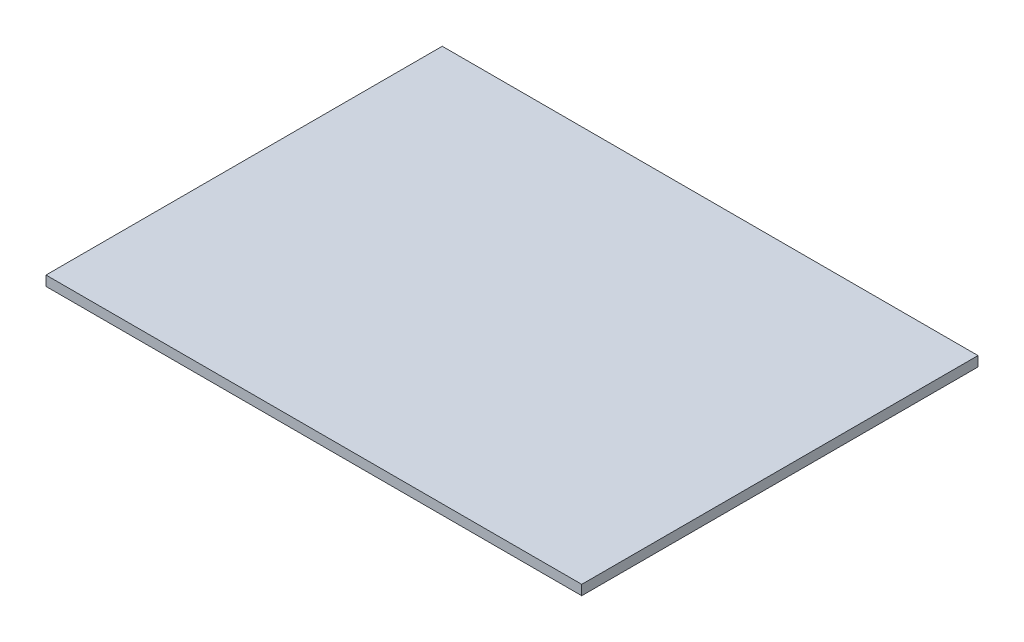
ISO-10303-21;
HEADER;
FILE_DESCRIPTION(('STEP AP214'),'2;1');
FILE_NAME('part.step','',(''),(''),'','','');
FILE_SCHEMA(('AUTOMOTIVE_DESIGN { 1 0 10303 214 1 1 1 1 }'));
ENDSEC;
DATA;
#1=APPLICATION_CONTEXT('core data for automotive mechanical design processes');
#2=APPLICATION_PROTOCOL_DEFINITION('international standard','automotive_design',2000,#1);
#3=PRODUCT_CONTEXT('',#1,'mechanical');
#4=PRODUCT('Part','Part','',(#3));
#5=PRODUCT_RELATED_PRODUCT_CATEGORY('part','',(#4));
#6=PRODUCT_DEFINITION_FORMATION('','',#4);
#7=PRODUCT_DEFINITION_CONTEXT('part definition',#1,'design');
#8=PRODUCT_DEFINITION('design','',#6,#7);
#9=PRODUCT_DEFINITION_SHAPE('','',#8);
#10=(LENGTH_UNIT() NAMED_UNIT(*) SI_UNIT(.MILLI.,.METRE.));
#11=(NAMED_UNIT(*) PLANE_ANGLE_UNIT() SI_UNIT($,.RADIAN.));
#12=(NAMED_UNIT(*) SI_UNIT($,.STERADIAN.) SOLID_ANGLE_UNIT());
#13=UNCERTAINTY_MEASURE_WITH_UNIT(LENGTH_MEASURE(1.E-05),#10,'distance_accuracy_value','');
#14=(GEOMETRIC_REPRESENTATION_CONTEXT(3) GLOBAL_UNCERTAINTY_ASSIGNED_CONTEXT((#13)) GLOBAL_UNIT_ASSIGNED_CONTEXT((#10,
#11,#12)) REPRESENTATION_CONTEXT('',''));
#15=CARTESIAN_POINT('',(0.,0.,0.));
#16=DIRECTION('',(0.,0.,1.));
#17=DIRECTION('',(1.,0.,0.));
#18=AXIS2_PLACEMENT_3D('',#15,#16,#17);
#19=CARTESIAN_POINT('',(405.6,15.,300.));
#20=DIRECTION('',(-1.,0.,0.));
#21=DIRECTION('',(0.,0.,1.));
#22=AXIS2_PLACEMENT_3D('',#19,#20,#21);
#23=PLANE('',#22);
#24=DIRECTION('',(0.,0.,-1.));
#25=VECTOR('',#24,1.);
#26=CARTESIAN_POINT('',(405.6,0.,300.));
#27=LINE('',#26,#25);
#28=CARTESIAN_POINT('',(405.6,0.,300.));
#29=VERTEX_POINT('',#28);
#30=CARTESIAN_POINT('',(405.6,0.,-300.));
#31=VERTEX_POINT('',#30);
#32=EDGE_CURVE('E96',#29,#31,#27,.T.);
#33=ORIENTED_EDGE('',*,*,#32,.T.);
#34=DIRECTION('',(0.,-1.,0.));
#35=VECTOR('',#34,1.);
#36=CARTESIAN_POINT('',(405.6,15.,-300.));
#37=LINE('',#36,#35);
#38=CARTESIAN_POINT('',(405.6,15.,-300.));
#39=VERTEX_POINT('',#38);
#40=EDGE_CURVE('E11',#39,#31,#37,.T.);
#41=ORIENTED_EDGE('',*,*,#40,.F.);
#42=DIRECTION('',(0.,0.,-1.));
#43=VECTOR('',#42,1.);
#44=CARTESIAN_POINT('',(405.6,15.,300.));
#45=LINE('',#44,#43);
#46=CARTESIAN_POINT('',(405.6,15.,300.));
#47=VERTEX_POINT('',#46);
#48=EDGE_CURVE('E84',#47,#39,#45,.T.);
#49=ORIENTED_EDGE('',*,*,#48,.F.);
#50=DIRECTION('',(0.,-1.,0.));
#51=VECTOR('',#50,1.);
#52=CARTESIAN_POINT('',(405.6,15.,300.));
#53=LINE('',#52,#51);
#54=EDGE_CURVE('E92',#47,#29,#53,.T.);
#55=ORIENTED_EDGE('',*,*,#54,.T.);
#56=EDGE_LOOP('',(#33,#41,#49,#55));
#57=FACE_BOUND('',#56,.T.);
#58=ADVANCED_FACE('F33',(#57),#23,.F.);
#59=CARTESIAN_POINT('',(-405.6,15.,-300.));
#60=DIRECTION('',(0.,0.,1.));
#61=DIRECTION('',(1.,0.,0.));
#62=AXIS2_PLACEMENT_3D('',#59,#60,#61);
#63=PLANE('',#62);
#64=DIRECTION('',(-1.,0.,0.));
#65=VECTOR('',#64,1.);
#66=CARTESIAN_POINT('',(-405.6,0.,-300.));
#67=LINE('',#66,#65);
#68=CARTESIAN_POINT('',(-405.6,0.,-300.));
#69=VERTEX_POINT('',#68);
#70=EDGE_CURVE('E88',#31,#69,#67,.T.);
#71=ORIENTED_EDGE('',*,*,#70,.T.);
#72=DIRECTION('',(0.,-1.,0.));
#73=VECTOR('',#72,1.);
#74=CARTESIAN_POINT('',(-405.6,15.,-300.));
#75=LINE('',#74,#73);
#76=CARTESIAN_POINT('',(-405.6,15.,-300.));
#77=VERTEX_POINT('',#76);
#78=EDGE_CURVE('E41',#77,#69,#75,.T.);
#79=ORIENTED_EDGE('',*,*,#78,.F.);
#80=DIRECTION('',(-1.,0.,0.));
#81=VECTOR('',#80,1.);
#82=CARTESIAN_POINT('',(-405.6,15.,-300.));
#83=LINE('',#82,#81);
#84=EDGE_CURVE('E79',#39,#77,#83,.T.);
#85=ORIENTED_EDGE('',*,*,#84,.F.);
#86=ORIENTED_EDGE('',*,*,#40,.T.);
#87=EDGE_LOOP('',(#71,#79,#85,#86));
#88=FACE_BOUND('',#87,.T.);
#89=ADVANCED_FACE('F87',(#88),#63,.F.);
#90=CARTESIAN_POINT('',(-405.6,15.,300.));
#91=DIRECTION('',(1.,0.,0.));
#92=DIRECTION('',(0.,0.,-1.));
#93=AXIS2_PLACEMENT_3D('',#90,#91,#92);
#94=PLANE('',#93);
#95=DIRECTION('',(0.,0.,1.));
#96=VECTOR('',#95,1.);
#97=CARTESIAN_POINT('',(-405.6,0.,300.));
#98=LINE('',#97,#96);
#99=CARTESIAN_POINT('',(-405.6,0.,300.));
#100=VERTEX_POINT('',#99);
#101=EDGE_CURVE('E66',#69,#100,#98,.T.);
#102=ORIENTED_EDGE('',*,*,#101,.T.);
#103=DIRECTION('',(0.,-1.,0.));
#104=VECTOR('',#103,1.);
#105=CARTESIAN_POINT('',(-405.6,15.,300.));
#106=LINE('',#105,#104);
#107=CARTESIAN_POINT('',(-405.6,15.,300.));
#108=VERTEX_POINT('',#107);
#109=EDGE_CURVE('E89',#108,#100,#106,.T.);
#110=ORIENTED_EDGE('',*,*,#109,.F.);
#111=DIRECTION('',(0.,0.,1.));
#112=VECTOR('',#111,1.);
#113=CARTESIAN_POINT('',(-405.6,15.,300.));
#114=LINE('',#113,#112);
#115=EDGE_CURVE('E82',#77,#108,#114,.T.);
#116=ORIENTED_EDGE('',*,*,#115,.F.);
#117=ORIENTED_EDGE('',*,*,#78,.T.);
#118=EDGE_LOOP('',(#102,#110,#116,#117));
#119=FACE_BOUND('',#118,.T.);
#120=ADVANCED_FACE('F90',(#119),#94,.F.);
#121=CARTESIAN_POINT('',(-405.6,15.,300.));
#122=DIRECTION('',(0.,0.,-1.));
#123=DIRECTION('',(-1.,0.,0.));
#124=AXIS2_PLACEMENT_3D('',#121,#122,#123);
#125=PLANE('',#124);
#126=DIRECTION('',(1.,0.,0.));
#127=VECTOR('',#126,1.);
#128=CARTESIAN_POINT('',(-405.6,0.,300.));
#129=LINE('',#128,#127);
#130=EDGE_CURVE('E72',#100,#29,#129,.T.);
#131=ORIENTED_EDGE('',*,*,#130,.T.);
#132=ORIENTED_EDGE('',*,*,#54,.F.);
#133=DIRECTION('',(1.,0.,0.));
#134=VECTOR('',#133,1.);
#135=CARTESIAN_POINT('',(-405.6,15.,300.));
#136=LINE('',#135,#134);
#137=EDGE_CURVE('E49',#108,#47,#136,.T.);
#138=ORIENTED_EDGE('',*,*,#137,.F.);
#139=ORIENTED_EDGE('',*,*,#109,.T.);
#140=EDGE_LOOP('',(#131,#132,#138,#139));
#141=FACE_BOUND('',#140,.T.);
#142=ADVANCED_FACE('F103',(#141),#125,.F.);
#143=CARTESIAN_POINT('',(0.,15.,0.));
#144=DIRECTION('',(0.,-1.,0.));
#145=DIRECTION('',(0.,0.,-1.));
#146=AXIS2_PLACEMENT_3D('',#143,#144,#145);
#147=PLANE('',#146);
#148=ORIENTED_EDGE('',*,*,#48,.T.);
#149=ORIENTED_EDGE('',*,*,#84,.T.);
#150=ORIENTED_EDGE('',*,*,#115,.T.);
#151=ORIENTED_EDGE('',*,*,#137,.T.);
#152=EDGE_LOOP('',(#148,#149,#150,#151));
#153=FACE_BOUND('',#152,.T.);
#154=ADVANCED_FACE('F80',(#153),#147,.F.);
#155=CARTESIAN_POINT('',(0.,0.,0.));
#156=DIRECTION('',(0.,-1.,0.));
#157=DIRECTION('',(0.,0.,-1.));
#158=AXIS2_PLACEMENT_3D('',#155,#156,#157);
#159=PLANE('',#158);
#160=ORIENTED_EDGE('',*,*,#32,.F.);
#161=ORIENTED_EDGE('',*,*,#130,.F.);
#162=ORIENTED_EDGE('',*,*,#101,.F.);
#163=ORIENTED_EDGE('',*,*,#70,.F.);
#164=EDGE_LOOP('',(#160,#161,#162,#163));
#165=FACE_BOUND('',#164,.T.);
#166=ADVANCED_FACE('F106',(#165),#159,.T.);
#167=CLOSED_SHELL('',(#58,#89,#120,#142,#154,#166));
#168=MANIFOLD_SOLID_BREP('B2',#167);
#169=ADVANCED_BREP_SHAPE_REPRESENTATION('',(#18,#168),#14);
#170=SHAPE_DEFINITION_REPRESENTATION(#9,#169);
ENDSEC;
END-ISO-10303-21;
